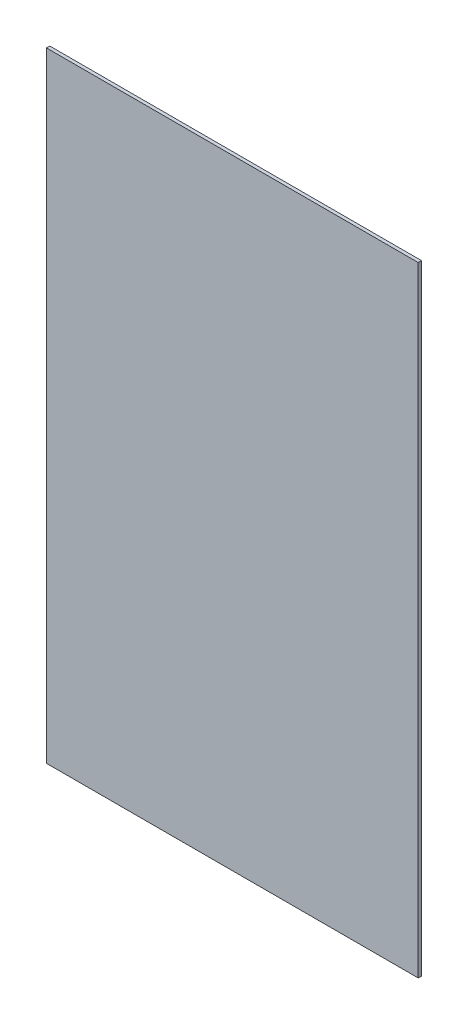
ISO-10303-21;
HEADER;
FILE_DESCRIPTION(('STEP AP214'),'2;1');
FILE_NAME('part.step','',(''),(''),'','','');
FILE_SCHEMA(('AUTOMOTIVE_DESIGN { 1 0 10303 214 1 1 1 1 }'));
ENDSEC;
DATA;
#1=APPLICATION_CONTEXT('core data for automotive mechanical design processes');
#2=APPLICATION_PROTOCOL_DEFINITION('international standard','automotive_design',2000,#1);
#3=PRODUCT_CONTEXT('',#1,'mechanical');
#4=PRODUCT('Part','Part','',(#3));
#5=PRODUCT_RELATED_PRODUCT_CATEGORY('part','',(#4));
#6=PRODUCT_DEFINITION_FORMATION('','',#4);
#7=PRODUCT_DEFINITION_CONTEXT('part definition',#1,'design');
#8=PRODUCT_DEFINITION('design','',#6,#7);
#9=PRODUCT_DEFINITION_SHAPE('','',#8);
#10=(LENGTH_UNIT() NAMED_UNIT(*) SI_UNIT(.MILLI.,.METRE.));
#11=(NAMED_UNIT(*) PLANE_ANGLE_UNIT() SI_UNIT($,.RADIAN.));
#12=(NAMED_UNIT(*) SI_UNIT($,.STERADIAN.) SOLID_ANGLE_UNIT());
#13=UNCERTAINTY_MEASURE_WITH_UNIT(LENGTH_MEASURE(1.E-05),#10,'distance_accuracy_value','');
#14=(GEOMETRIC_REPRESENTATION_CONTEXT(3) GLOBAL_UNCERTAINTY_ASSIGNED_CONTEXT((#13)) GLOBAL_UNIT_ASSIGNED_CONTEXT((#10,
#11,#12)) REPRESENTATION_CONTEXT('',''));
#15=CARTESIAN_POINT('',(0.,0.,0.));
#16=DIRECTION('',(0.,0.,1.));
#17=DIRECTION('',(1.,0.,0.));
#18=AXIS2_PLACEMENT_3D('',#15,#16,#17);
#19=CARTESIAN_POINT('',(90.,-150.,-1.6));
#20=DIRECTION('',(1.,0.,0.));
#21=DIRECTION('',(0.,0.,-1.));
#22=AXIS2_PLACEMENT_3D('',#19,#20,#21);
#23=PLANE('',#22);
#24=DIRECTION('',(0.,1.,0.));
#25=VECTOR('',#24,1.);
#26=CARTESIAN_POINT('',(90.,-150.,0.));
#27=LINE('',#26,#25);
#28=CARTESIAN_POINT('',(90.,-150.,0.));
#29=VERTEX_POINT('',#28);
#30=CARTESIAN_POINT('',(90.,150.,0.));
#31=VERTEX_POINT('',#30);
#32=EDGE_CURVE('E97',#29,#31,#27,.T.);
#33=ORIENTED_EDGE('',*,*,#32,.F.);
#34=DIRECTION('',(0.,0.,1.));
#35=VECTOR('',#34,1.);
#36=CARTESIAN_POINT('',(90.,-150.,-1.6));
#37=LINE('',#36,#35);
#38=CARTESIAN_POINT('',(90.,-150.,-1.6));
#39=VERTEX_POINT('',#38);
#40=EDGE_CURVE('E11',#39,#29,#37,.T.);
#41=ORIENTED_EDGE('',*,*,#40,.F.);
#42=DIRECTION('',(0.,1.,0.));
#43=VECTOR('',#42,1.);
#44=CARTESIAN_POINT('',(90.,-150.,-1.6));
#45=LINE('',#44,#43);
#46=CARTESIAN_POINT('',(90.,150.,-1.6));
#47=VERTEX_POINT('',#46);
#48=EDGE_CURVE('E91',#39,#47,#45,.T.);
#49=ORIENTED_EDGE('',*,*,#48,.T.);
#50=DIRECTION('',(0.,0.,1.));
#51=VECTOR('',#50,1.);
#52=CARTESIAN_POINT('',(90.,150.,-1.6));
#53=LINE('',#52,#51);
#54=EDGE_CURVE('E36',#47,#31,#53,.T.);
#55=ORIENTED_EDGE('',*,*,#54,.T.);
#56=EDGE_LOOP('',(#33,#41,#49,#55));
#57=FACE_BOUND('',#56,.T.);
#58=ADVANCED_FACE('F33',(#57),#23,.T.);
#59=CARTESIAN_POINT('',(-90.,-150.,-1.6));
#60=DIRECTION('',(0.,-1.,0.));
#61=DIRECTION('',(0.,0.,-1.));
#62=AXIS2_PLACEMENT_3D('',#59,#60,#61);
#63=PLANE('',#62);
#64=DIRECTION('',(1.,0.,0.));
#65=VECTOR('',#64,1.);
#66=CARTESIAN_POINT('',(-90.,-150.,0.));
#67=LINE('',#66,#65);
#68=CARTESIAN_POINT('',(-90.,-150.,0.));
#69=VERTEX_POINT('',#68);
#70=EDGE_CURVE('E93',#69,#29,#67,.T.);
#71=ORIENTED_EDGE('',*,*,#70,.F.);
#72=DIRECTION('',(0.,0.,1.));
#73=VECTOR('',#72,1.);
#74=CARTESIAN_POINT('',(-90.,-150.,-1.6));
#75=LINE('',#74,#73);
#76=CARTESIAN_POINT('',(-90.,-150.,-1.6));
#77=VERTEX_POINT('',#76);
#78=EDGE_CURVE('E42',#77,#69,#75,.T.);
#79=ORIENTED_EDGE('',*,*,#78,.F.);
#80=DIRECTION('',(1.,0.,0.));
#81=VECTOR('',#80,1.);
#82=CARTESIAN_POINT('',(-90.,-150.,-1.6));
#83=LINE('',#82,#81);
#84=EDGE_CURVE('E88',#77,#39,#83,.T.);
#85=ORIENTED_EDGE('',*,*,#84,.T.);
#86=ORIENTED_EDGE('',*,*,#40,.T.);
#87=EDGE_LOOP('',(#71,#79,#85,#86));
#88=FACE_BOUND('',#87,.T.);
#89=ADVANCED_FACE('F107',(#88),#63,.T.);
#90=CARTESIAN_POINT('',(-90.,-150.,-1.6));
#91=DIRECTION('',(-1.,0.,0.));
#92=DIRECTION('',(0.,0.,1.));
#93=AXIS2_PLACEMENT_3D('',#90,#91,#92);
#94=PLANE('',#93);
#95=DIRECTION('',(0.,-1.,0.));
#96=VECTOR('',#95,1.);
#97=CARTESIAN_POINT('',(-90.,-150.,0.));
#98=LINE('',#97,#96);
#99=CARTESIAN_POINT('',(-90.,150.,0.));
#100=VERTEX_POINT('',#99);
#101=EDGE_CURVE('E83',#100,#69,#98,.T.);
#102=ORIENTED_EDGE('',*,*,#101,.F.);
#103=DIRECTION('',(0.,0.,1.));
#104=VECTOR('',#103,1.);
#105=CARTESIAN_POINT('',(-90.,150.,-1.6));
#106=LINE('',#105,#104);
#107=CARTESIAN_POINT('',(-90.,150.,-1.6));
#108=VERTEX_POINT('',#107);
#109=EDGE_CURVE('E78',#108,#100,#106,.T.);
#110=ORIENTED_EDGE('',*,*,#109,.F.);
#111=DIRECTION('',(0.,-1.,0.));
#112=VECTOR('',#111,1.);
#113=CARTESIAN_POINT('',(-90.,-150.,-1.6));
#114=LINE('',#113,#112);
#115=EDGE_CURVE('E81',#108,#77,#114,.T.);
#116=ORIENTED_EDGE('',*,*,#115,.T.);
#117=ORIENTED_EDGE('',*,*,#78,.T.);
#118=EDGE_LOOP('',(#102,#110,#116,#117));
#119=FACE_BOUND('',#118,.T.);
#120=ADVANCED_FACE('F80',(#119),#94,.T.);
#121=CARTESIAN_POINT('',(-90.,150.,-1.6));
#122=DIRECTION('',(0.,1.,0.));
#123=DIRECTION('',(0.,0.,1.));
#124=AXIS2_PLACEMENT_3D('',#121,#122,#123);
#125=PLANE('',#124);
#126=DIRECTION('',(-1.,0.,0.));
#127=VECTOR('',#126,1.);
#128=CARTESIAN_POINT('',(-90.,150.,0.));
#129=LINE('',#128,#127);
#130=EDGE_CURVE('E100',#31,#100,#129,.T.);
#131=ORIENTED_EDGE('',*,*,#130,.F.);
#132=ORIENTED_EDGE('',*,*,#54,.F.);
#133=DIRECTION('',(-1.,0.,0.));
#134=VECTOR('',#133,1.);
#135=CARTESIAN_POINT('',(-90.,150.,-1.6));
#136=LINE('',#135,#134);
#137=EDGE_CURVE('E87',#47,#108,#136,.T.);
#138=ORIENTED_EDGE('',*,*,#137,.T.);
#139=ORIENTED_EDGE('',*,*,#109,.T.);
#140=EDGE_LOOP('',(#131,#132,#138,#139));
#141=FACE_BOUND('',#140,.T.);
#142=ADVANCED_FACE('F90',(#141),#125,.T.);
#143=CARTESIAN_POINT('',(90.,150.,-1.6));
#144=DIRECTION('',(0.,0.,-1.));
#145=DIRECTION('',(-1.,0.,0.));
#146=AXIS2_PLACEMENT_3D('',#143,#144,#145);
#147=PLANE('',#146);
#148=ORIENTED_EDGE('',*,*,#48,.F.);
#149=ORIENTED_EDGE('',*,*,#84,.F.);
#150=ORIENTED_EDGE('',*,*,#115,.F.);
#151=ORIENTED_EDGE('',*,*,#137,.F.);
#152=EDGE_LOOP('',(#148,#149,#150,#151));
#153=FACE_BOUND('',#152,.T.);
#154=ADVANCED_FACE('F86',(#153),#147,.T.);
#155=CARTESIAN_POINT('',(90.,150.,0.));
#156=DIRECTION('',(0.,0.,-1.));
#157=DIRECTION('',(-1.,0.,0.));
#158=AXIS2_PLACEMENT_3D('',#155,#156,#157);
#159=PLANE('',#158);
#160=ORIENTED_EDGE('',*,*,#32,.T.);
#161=ORIENTED_EDGE('',*,*,#130,.T.);
#162=ORIENTED_EDGE('',*,*,#101,.T.);
#163=ORIENTED_EDGE('',*,*,#70,.T.);
#164=EDGE_LOOP('',(#160,#161,#162,#163));
#165=FACE_BOUND('',#164,.T.);
#166=ADVANCED_FACE('F106',(#165),#159,.F.);
#167=CLOSED_SHELL('',(#58,#89,#120,#142,#154,#166));
#168=MANIFOLD_SOLID_BREP('B2',#167);
#169=ADVANCED_BREP_SHAPE_REPRESENTATION('',(#18,#168),#14);
#170=SHAPE_DEFINITION_REPRESENTATION(#9,#169);
ENDSEC;
END-ISO-10303-21;
